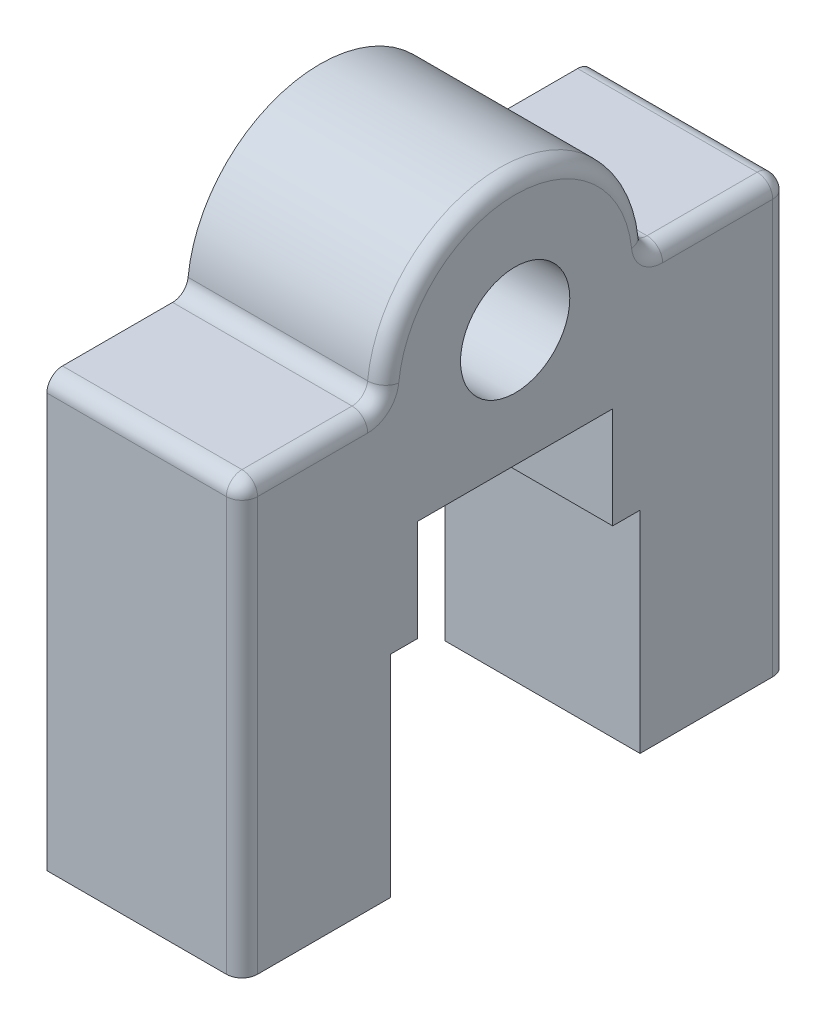
ISO-10303-21;
HEADER;
FILE_DESCRIPTION(('STEP AP214'),'2;1');
FILE_NAME('part.step','',(''),(''),'','','');
FILE_SCHEMA(('AUTOMOTIVE_DESIGN { 1 0 10303 214 1 1 1 1 }'));
ENDSEC;
DATA;
#1=APPLICATION_CONTEXT('core data for automotive mechanical design processes');
#2=APPLICATION_PROTOCOL_DEFINITION('international standard','automotive_design',2000,#1);
#3=PRODUCT_CONTEXT('',#1,'mechanical');
#4=PRODUCT('Part','Part','',(#3));
#5=PRODUCT_RELATED_PRODUCT_CATEGORY('part','',(#4));
#6=PRODUCT_DEFINITION_FORMATION('','',#4);
#7=PRODUCT_DEFINITION_CONTEXT('part definition',#1,'design');
#8=PRODUCT_DEFINITION('design','',#6,#7);
#9=PRODUCT_DEFINITION_SHAPE('','',#8);
#10=(LENGTH_UNIT() NAMED_UNIT(*) SI_UNIT(.MILLI.,.METRE.));
#11=(NAMED_UNIT(*) PLANE_ANGLE_UNIT() SI_UNIT($,.RADIAN.));
#12=(NAMED_UNIT(*) SI_UNIT($,.STERADIAN.) SOLID_ANGLE_UNIT());
#13=UNCERTAINTY_MEASURE_WITH_UNIT(LENGTH_MEASURE(1.E-05),#10,'distance_accuracy_value','');
#14=(GEOMETRIC_REPRESENTATION_CONTEXT(3) GLOBAL_UNCERTAINTY_ASSIGNED_CONTEXT((#13)) GLOBAL_UNIT_ASSIGNED_CONTEXT((#10,
#11,#12)) REPRESENTATION_CONTEXT('',''));
#15=CARTESIAN_POINT('',(0.,0.,0.));
#16=DIRECTION('',(0.,0.,1.));
#17=DIRECTION('',(1.,0.,0.));
#18=AXIS2_PLACEMENT_3D('',#15,#16,#17);
#19=CARTESIAN_POINT('',(25.,0.,35.));
#20=DIRECTION('',(0.,1.,0.));
#21=DIRECTION('',(0.,0.,1.));
#22=AXIS2_PLACEMENT_3D('',#19,#20,#21);
#23=PLANE('',#22);
#24=DIRECTION('',(0.,0.,-1.));
#25=VECTOR('',#24,1.);
#26=CARTESIAN_POINT('',(25.,0.,35.));
#27=LINE('',#26,#25);
#28=CARTESIAN_POINT('',(25.,0.,33.));
#29=VERTEX_POINT('',#28);
#30=CARTESIAN_POINT('',(25.,0.,16.));
#31=VERTEX_POINT('',#30);
#32=EDGE_CURVE('E236',#29,#31,#27,.T.);
#33=ORIENTED_EDGE('',*,*,#32,.F.);
#34=CARTESIAN_POINT('',(23.,0.,33.));
#35=DIRECTION('',(0.,1.,0.));
#36=DIRECTION('',(0.,0.,1.));
#37=AXIS2_PLACEMENT_3D('',#34,#35,#36);
#38=CIRCLE('',#37,2.);
#39=CARTESIAN_POINT('',(23.,0.,35.));
#40=VERTEX_POINT('',#39);
#41=EDGE_CURVE('E280',#29,#40,#38,.F.);
#42=ORIENTED_EDGE('',*,*,#41,.T.);
#43=DIRECTION('',(-1.,0.,0.));
#44=VECTOR('',#43,1.);
#45=CARTESIAN_POINT('',(25.,0.,35.));
#46=LINE('',#45,#44);
#47=CARTESIAN_POINT('',(0.,0.,35.));
#48=VERTEX_POINT('',#47);
#49=EDGE_CURVE('E212',#40,#48,#46,.T.);
#50=ORIENTED_EDGE('',*,*,#49,.T.);
#51=DIRECTION('',(0.,0.,-1.));
#52=VECTOR('',#51,1.);
#53=CARTESIAN_POINT('',(0.,0.,35.));
#54=LINE('',#53,#52);
#55=CARTESIAN_POINT('',(0.,0.,16.));
#56=VERTEX_POINT('',#55);
#57=EDGE_CURVE('E205',#48,#56,#54,.T.);
#58=ORIENTED_EDGE('',*,*,#57,.T.);
#59=DIRECTION('',(1.,0.,0.));
#60=VECTOR('',#59,1.);
#61=CARTESIAN_POINT('',(0.,0.,16.));
#62=LINE('',#61,#60);
#63=EDGE_CURVE('E186',#56,#31,#62,.T.);
#64=ORIENTED_EDGE('',*,*,#63,.T.);
#65=EDGE_LOOP('',(#33,#42,#50,#58,#64));
#66=FACE_BOUND('',#65,.T.);
#67=ADVANCED_FACE('F34',(#66),#23,.F.);
#68=CARTESIAN_POINT('',(25.,55.,0.));
#69=DIRECTION('',(1.,0.,0.));
#70=DIRECTION('',(0.,0.,-1.));
#71=AXIS2_PLACEMENT_3D('',#68,#69,#70);
#72=PLANE('',#71);
#73=DIRECTION('',(0.,0.,1.));
#74=VECTOR('',#73,1.);
#75=CARTESIAN_POINT('',(25.,53.,33.));
#76=LINE('',#75,#74);
#77=CARTESIAN_POINT('',(25.,53.,18.8944436276912));
#78=VERTEX_POINT('',#77);
#79=CARTESIAN_POINT('',(25.,53.,33.));
#80=VERTEX_POINT('',#79);
#81=EDGE_CURVE('E275',#78,#80,#76,.T.);
#82=ORIENTED_EDGE('',*,*,#81,.T.);
#83=DIRECTION('',(0.,-1.,0.));
#84=VECTOR('',#83,1.);
#85=CARTESIAN_POINT('',(25.,0.,33.));
#86=LINE('',#85,#84);
#87=EDGE_CURVE('E277',#80,#29,#86,.T.);
#88=ORIENTED_EDGE('',*,*,#87,.T.);
#89=ORIENTED_EDGE('',*,*,#32,.T.);
#90=DIRECTION('',(0.,-1.,0.));
#91=VECTOR('',#90,1.);
#92=CARTESIAN_POINT('',(25.,27.,16.));
#93=LINE('',#92,#91);
#94=CARTESIAN_POINT('',(25.,27.,16.));
#95=VERTEX_POINT('',#94);
#96=EDGE_CURVE('E192',#95,#31,#93,.T.);
#97=ORIENTED_EDGE('',*,*,#96,.F.);
#98=DIRECTION('',(0.,0.,1.));
#99=VECTOR('',#98,1.);
#100=CARTESIAN_POINT('',(25.,27.,16.));
#101=LINE('',#100,#99);
#102=CARTESIAN_POINT('',(25.,27.,12.5));
#103=VERTEX_POINT('',#102);
#104=EDGE_CURVE('E209',#103,#95,#101,.T.);
#105=ORIENTED_EDGE('',*,*,#104,.F.);
#106=DIRECTION('',(0.,-1.,0.));
#107=VECTOR('',#106,1.);
#108=CARTESIAN_POINT('',(25.,27.,12.5));
#109=LINE('',#108,#107);
#110=CARTESIAN_POINT('',(25.,40.,12.5));
#111=VERTEX_POINT('',#110);
#112=EDGE_CURVE('E340',#111,#103,#109,.T.);
#113=ORIENTED_EDGE('',*,*,#112,.F.);
#114=DIRECTION('',(0.,0.,1.));
#115=VECTOR('',#114,1.);
#116=CARTESIAN_POINT('',(25.,40.,12.5));
#117=LINE('',#116,#115);
#118=CARTESIAN_POINT('',(25.,40.,-12.5));
#119=VERTEX_POINT('',#118);
#120=EDGE_CURVE('E337',#119,#111,#117,.T.);
#121=ORIENTED_EDGE('',*,*,#120,.F.);
#122=DIRECTION('',(0.,1.,0.));
#123=VECTOR('',#122,1.);
#124=CARTESIAN_POINT('',(25.,27.,-12.5));
#125=LINE('',#124,#123);
#126=CARTESIAN_POINT('',(25.,27.,-12.5));
#127=VERTEX_POINT('',#126);
#128=EDGE_CURVE('E334',#127,#119,#125,.T.);
#129=ORIENTED_EDGE('',*,*,#128,.F.);
#130=DIRECTION('',(0.,0.,1.));
#131=VECTOR('',#130,1.);
#132=CARTESIAN_POINT('',(25.,27.,-12.5));
#133=LINE('',#132,#131);
#134=CARTESIAN_POINT('',(25.,27.,-16.));
#135=VERTEX_POINT('',#134);
#136=EDGE_CURVE('E327',#135,#127,#133,.T.);
#137=ORIENTED_EDGE('',*,*,#136,.F.);
#138=DIRECTION('',(0.,1.,0.));
#139=VECTOR('',#138,1.);
#140=CARTESIAN_POINT('',(25.,27.,-16.));
#141=LINE('',#140,#139);
#142=CARTESIAN_POINT('',(25.,0.,-16.));
#143=VERTEX_POINT('',#142);
#144=EDGE_CURVE('E324',#143,#135,#141,.T.);
#145=ORIENTED_EDGE('',*,*,#144,.F.);
#146=CARTESIAN_POINT('',(25.,0.,-33.));
#147=VERTEX_POINT('',#146);
#148=EDGE_CURVE('E233',#143,#147,#27,.T.);
#149=ORIENTED_EDGE('',*,*,#148,.T.);
#150=DIRECTION('',(0.,1.,0.));
#151=VECTOR('',#150,1.);
#152=CARTESIAN_POINT('',(25.,53.,-33.));
#153=LINE('',#152,#151);
#154=CARTESIAN_POINT('',(25.,53.,-33.));
#155=VERTEX_POINT('',#154);
#156=EDGE_CURVE('E265',#147,#155,#153,.T.);
#157=ORIENTED_EDGE('',*,*,#156,.T.);
#158=DIRECTION('',(0.,0.,1.));
#159=VECTOR('',#158,1.);
#160=CARTESIAN_POINT('',(25.,53.,-18.8944436276912));
#161=LINE('',#160,#159);
#162=CARTESIAN_POINT('',(25.,53.,-18.8944436276912));
#163=VERTEX_POINT('',#162);
#164=EDGE_CURVE('E267',#155,#163,#161,.T.);
#165=ORIENTED_EDGE('',*,*,#164,.T.);
#166=CARTESIAN_POINT('',(25.,57.,-18.8944436276912));
#167=DIRECTION('',(1.,0.,0.));
#168=DIRECTION('',(0.,0.,-1.));
#169=AXIS2_PLACEMENT_3D('',#166,#167,#168);
#170=CIRCLE('',#169,4.);
#171=CARTESIAN_POINT('',(25.,56.578947368421,-14.9166660218615));
#172=VERTEX_POINT('',#171);
#173=EDGE_CURVE('E269',#163,#172,#170,.F.);
#174=ORIENTED_EDGE('',*,*,#173,.T.);
#175=CARTESIAN_POINT('',(25.,55.,0.));
#176=DIRECTION('',(1.,0.,0.));
#177=DIRECTION('',(0.,0.,-1.));
#178=AXIS2_PLACEMENT_3D('',#175,#176,#177);
#179=CIRCLE('',#178,15.);
#180=CARTESIAN_POINT('',(25.,56.578947368421,14.9166660218615));
#181=VERTEX_POINT('',#180);
#182=EDGE_CURVE('E271',#172,#181,#179,.T.);
#183=ORIENTED_EDGE('',*,*,#182,.T.);
#184=CARTESIAN_POINT('',(25.,57.,18.8944436276912));
#185=DIRECTION('',(1.,0.,0.));
#186=DIRECTION('',(0.,0.,-1.));
#187=AXIS2_PLACEMENT_3D('',#184,#185,#186);
#188=CIRCLE('',#187,4.);
#189=EDGE_CURVE('E273',#181,#78,#188,.F.);
#190=ORIENTED_EDGE('',*,*,#189,.T.);
#191=EDGE_LOOP('',(#82,#88,#89,#97,#105,#113,#121,#129,#137,#145,#149,#157,#165,#174,#183,#190));
#192=FACE_BOUND('',#191,.T.);
#193=CARTESIAN_POINT('',(25.,55.,0.));
#194=DIRECTION('',(1.,0.,0.));
#195=DIRECTION('',(0.,0.,-1.));
#196=AXIS2_PLACEMENT_3D('',#193,#194,#195);
#197=CIRCLE('',#196,7.);
#198=CARTESIAN_POINT('',(25.,55.,-7.));
#199=VERTEX_POINT('',#198);
#200=EDGE_CURVE('E359',#199,#199,#197,.T.);
#201=ORIENTED_EDGE('',*,*,#200,.F.);
#202=EDGE_LOOP('',(#201));
#203=FACE_BOUND('',#202,.T.);
#204=ADVANCED_FACE('F368',(#192,#203),#72,.T.);
#205=CARTESIAN_POINT('',(0.,55.,0.));
#206=DIRECTION('',(1.,0.,0.));
#207=DIRECTION('',(0.,0.,-1.));
#208=AXIS2_PLACEMENT_3D('',#205,#206,#207);
#209=PLANE('',#208);
#210=DIRECTION('',(0.,0.,1.));
#211=VECTOR('',#210,1.);
#212=CARTESIAN_POINT('',(0.,55.,-17.));
#213=LINE('',#212,#211);
#214=CARTESIAN_POINT('',(0.,55.,-33.));
#215=VERTEX_POINT('',#214);
#216=CARTESIAN_POINT('',(0.,55.,-18.8944436276912));
#217=VERTEX_POINT('',#216);
#218=EDGE_CURVE('E218',#215,#217,#213,.T.);
#219=ORIENTED_EDGE('',*,*,#218,.F.);
#220=CARTESIAN_POINT('',(0.,53.,-33.));
#221=DIRECTION('',(1.,0.,0.));
#222=DIRECTION('',(0.,0.,-1.));
#223=AXIS2_PLACEMENT_3D('',#220,#221,#222);
#224=CIRCLE('',#223,2.);
#225=CARTESIAN_POINT('',(0.,53.,-35.));
#226=VERTEX_POINT('',#225);
#227=EDGE_CURVE('E245',#215,#226,#224,.F.);
#228=ORIENTED_EDGE('',*,*,#227,.T.);
#229=DIRECTION('',(0.,1.,0.));
#230=VECTOR('',#229,1.);
#231=CARTESIAN_POINT('',(0.,0.,-35.));
#232=LINE('',#231,#230);
#233=CARTESIAN_POINT('',(0.,0.,-35.));
#234=VERTEX_POINT('',#233);
#235=EDGE_CURVE('E214',#234,#226,#232,.T.);
#236=ORIENTED_EDGE('',*,*,#235,.F.);
#237=CARTESIAN_POINT('',(0.,0.,-16.));
#238=VERTEX_POINT('',#237);
#239=EDGE_CURVE('E215',#238,#234,#54,.T.);
#240=ORIENTED_EDGE('',*,*,#239,.F.);
#241=DIRECTION('',(0.,1.,0.));
#242=VECTOR('',#241,1.);
#243=CARTESIAN_POINT('',(0.,27.,-16.));
#244=LINE('',#243,#242);
#245=CARTESIAN_POINT('',(0.,27.,-16.));
#246=VERTEX_POINT('',#245);
#247=EDGE_CURVE('E208',#238,#246,#244,.T.);
#248=ORIENTED_EDGE('',*,*,#247,.T.);
#249=DIRECTION('',(0.,0.,1.));
#250=VECTOR('',#249,1.);
#251=CARTESIAN_POINT('',(0.,27.,-12.5));
#252=LINE('',#251,#250);
#253=CARTESIAN_POINT('',(0.,27.,-12.5));
#254=VERTEX_POINT('',#253);
#255=EDGE_CURVE('E513',#246,#254,#252,.T.);
#256=ORIENTED_EDGE('',*,*,#255,.T.);
#257=DIRECTION('',(0.,1.,0.));
#258=VECTOR('',#257,1.);
#259=CARTESIAN_POINT('',(0.,27.,-12.5));
#260=LINE('',#259,#258);
#261=CARTESIAN_POINT('',(0.,40.,-12.5));
#262=VERTEX_POINT('',#261);
#263=EDGE_CURVE('E516',#254,#262,#260,.T.);
#264=ORIENTED_EDGE('',*,*,#263,.T.);
#265=DIRECTION('',(0.,0.,1.));
#266=VECTOR('',#265,1.);
#267=CARTESIAN_POINT('',(0.,40.,12.5));
#268=LINE('',#267,#266);
#269=CARTESIAN_POINT('',(0.,40.,12.5));
#270=VERTEX_POINT('',#269);
#271=EDGE_CURVE('E508',#262,#270,#268,.T.);
#272=ORIENTED_EDGE('',*,*,#271,.T.);
#273=DIRECTION('',(0.,-1.,0.));
#274=VECTOR('',#273,1.);
#275=CARTESIAN_POINT('',(0.,27.,12.5));
#276=LINE('',#275,#274);
#277=CARTESIAN_POINT('',(0.,27.,12.5));
#278=VERTEX_POINT('',#277);
#279=EDGE_CURVE('E505',#270,#278,#276,.T.);
#280=ORIENTED_EDGE('',*,*,#279,.T.);
#281=DIRECTION('',(0.,0.,1.));
#282=VECTOR('',#281,1.);
#283=CARTESIAN_POINT('',(0.,27.,16.));
#284=LINE('',#283,#282);
#285=CARTESIAN_POINT('',(0.,27.,16.));
#286=VERTEX_POINT('',#285);
#287=EDGE_CURVE('E197',#278,#286,#284,.T.);
#288=ORIENTED_EDGE('',*,*,#287,.T.);
#289=DIRECTION('',(0.,-1.,0.));
#290=VECTOR('',#289,1.);
#291=CARTESIAN_POINT('',(0.,27.,16.));
#292=LINE('',#291,#290);
#293=EDGE_CURVE('E189',#286,#56,#292,.T.);
#294=ORIENTED_EDGE('',*,*,#293,.T.);
#295=ORIENTED_EDGE('',*,*,#57,.F.);
#296=DIRECTION('',(0.,-1.,0.));
#297=VECTOR('',#296,1.);
#298=CARTESIAN_POINT('',(0.,0.,35.));
#299=LINE('',#298,#297);
#300=CARTESIAN_POINT('',(0.,53.,35.));
#301=VERTEX_POINT('',#300);
#302=EDGE_CURVE('E221',#301,#48,#299,.T.);
#303=ORIENTED_EDGE('',*,*,#302,.F.);
#304=CARTESIAN_POINT('',(0.,53.,33.));
#305=DIRECTION('',(1.,0.,0.));
#306=DIRECTION('',(0.,0.,-1.));
#307=AXIS2_PLACEMENT_3D('',#304,#305,#306);
#308=CIRCLE('',#307,2.);
#309=CARTESIAN_POINT('',(0.,55.,33.));
#310=VERTEX_POINT('',#309);
#311=EDGE_CURVE('E243',#301,#310,#308,.F.);
#312=ORIENTED_EDGE('',*,*,#311,.T.);
#313=DIRECTION('',(0.,0.,1.));
#314=VECTOR('',#313,1.);
#315=CARTESIAN_POINT('',(0.,55.,35.));
#316=LINE('',#315,#314);
#317=CARTESIAN_POINT('',(0.,55.,18.8944436276912));
#318=VERTEX_POINT('',#317);
#319=EDGE_CURVE('E230',#318,#310,#316,.T.);
#320=ORIENTED_EDGE('',*,*,#319,.F.);
#321=CARTESIAN_POINT('',(0.,57.,18.8944436276912));
#322=DIRECTION('',(1.,0.,0.));
#323=DIRECTION('',(0.,0.,-1.));
#324=AXIS2_PLACEMENT_3D('',#321,#322,#323);
#325=CIRCLE('',#324,2.);
#326=CARTESIAN_POINT('',(0.,56.7894736842105,16.9055548247763));
#327=VERTEX_POINT('',#326);
#328=EDGE_CURVE('E263',#318,#327,#325,.T.);
#329=ORIENTED_EDGE('',*,*,#328,.T.);
#330=CARTESIAN_POINT('',(0.,55.,0.));
#331=DIRECTION('',(1.,0.,0.));
#332=DIRECTION('',(0.,0.,-1.));
#333=AXIS2_PLACEMENT_3D('',#330,#331,#332);
#334=CIRCLE('',#333,17.);
#335=CARTESIAN_POINT('',(0.,56.7894736842105,-16.9055548247763));
#336=VERTEX_POINT('',#335);
#337=EDGE_CURVE('E227',#336,#327,#334,.T.);
#338=ORIENTED_EDGE('',*,*,#337,.F.);
#339=CARTESIAN_POINT('',(0.,57.,-18.8944436276912));
#340=DIRECTION('',(1.,0.,0.));
#341=DIRECTION('',(0.,0.,-1.));
#342=AXIS2_PLACEMENT_3D('',#339,#340,#341);
#343=CIRCLE('',#342,2.);
#344=EDGE_CURVE('E261',#336,#217,#343,.T.);
#345=ORIENTED_EDGE('',*,*,#344,.T.);
#346=EDGE_LOOP('',(#219,#228,#236,#240,#248,#256,#264,#272,#280,#288,#294,#295,#303,#312,#320,
#329,#338,#345));
#347=FACE_BOUND('',#346,.T.);
#348=CARTESIAN_POINT('',(0.,55.,0.));
#349=DIRECTION('',(1.,0.,0.));
#350=DIRECTION('',(0.,0.,-1.));
#351=AXIS2_PLACEMENT_3D('',#348,#349,#350);
#352=CIRCLE('',#351,7.);
#353=CARTESIAN_POINT('',(0.,55.,-7.));
#354=VERTEX_POINT('',#353);
#355=EDGE_CURVE('E347',#354,#354,#352,.T.);
#356=ORIENTED_EDGE('',*,*,#355,.T.);
#357=EDGE_LOOP('',(#356));
#358=FACE_BOUND('',#357,.T.);
#359=ADVANCED_FACE('F202',(#347,#358),#209,.F.);
#360=CARTESIAN_POINT('',(25.,0.,35.));
#361=DIRECTION('',(0.,0.,-1.));
#362=DIRECTION('',(-1.,0.,0.));
#363=AXIS2_PLACEMENT_3D('',#360,#361,#362);
#364=PLANE('',#363);
#365=ORIENTED_EDGE('',*,*,#49,.F.);
#366=DIRECTION('',(0.,-1.,0.));
#367=VECTOR('',#366,1.);
#368=CARTESIAN_POINT('',(23.,53.,35.));
#369=LINE('',#368,#367);
#370=CARTESIAN_POINT('',(23.,53.,35.));
#371=VERTEX_POINT('',#370);
#372=EDGE_CURVE('E282',#40,#371,#369,.F.);
#373=ORIENTED_EDGE('',*,*,#372,.T.);
#374=DIRECTION('',(-1.,0.,0.));
#375=VECTOR('',#374,1.);
#376=CARTESIAN_POINT('',(25.,53.,35.));
#377=LINE('',#376,#375);
#378=EDGE_CURVE('E259',#371,#301,#377,.T.);
#379=ORIENTED_EDGE('',*,*,#378,.T.);
#380=ORIENTED_EDGE('',*,*,#302,.T.);
#381=EDGE_LOOP('',(#365,#373,#379,#380));
#382=FACE_BOUND('',#381,.T.);
#383=ADVANCED_FACE('F407',(#382),#364,.F.);
#384=DIRECTION('',(-1.,0.,0.));
#385=VECTOR('',#384,1.);
#386=CARTESIAN_POINT('',(25.,0.,-35.));
#387=LINE('',#386,#385);
#388=CARTESIAN_POINT('',(23.,0.,-35.));
#389=VERTEX_POINT('',#388);
#390=EDGE_CURVE('E234',#389,#234,#387,.T.);
#391=ORIENTED_EDGE('',*,*,#390,.F.);
#392=CARTESIAN_POINT('',(23.,0.,-33.));
#393=DIRECTION('',(0.,1.,0.));
#394=DIRECTION('',(0.,0.,1.));
#395=AXIS2_PLACEMENT_3D('',#392,#393,#394);
#396=CIRCLE('',#395,2.);
#397=EDGE_CURVE('E11',#389,#147,#396,.F.);
#398=ORIENTED_EDGE('',*,*,#397,.T.);
#399=ORIENTED_EDGE('',*,*,#148,.F.);
#400=DIRECTION('',(1.,0.,0.));
#401=VECTOR('',#400,1.);
#402=CARTESIAN_POINT('',(0.,0.,-16.));
#403=LINE('',#402,#401);
#404=EDGE_CURVE('E196',#238,#143,#403,.T.);
#405=ORIENTED_EDGE('',*,*,#404,.F.);
#406=ORIENTED_EDGE('',*,*,#239,.T.);
#407=EDGE_LOOP('',(#391,#398,#399,#405,#406));
#408=FACE_BOUND('',#407,.T.);
#409=ADVANCED_FACE('F431',(#408),#23,.F.);
#410=CARTESIAN_POINT('',(25.,0.,-35.));
#411=DIRECTION('',(0.,0.,1.));
#412=DIRECTION('',(1.,0.,0.));
#413=AXIS2_PLACEMENT_3D('',#410,#411,#412);
#414=PLANE('',#413);
#415=DIRECTION('',(-1.,0.,0.));
#416=VECTOR('',#415,1.);
#417=CARTESIAN_POINT('',(25.,53.,-35.));
#418=LINE('',#417,#416);
#419=CARTESIAN_POINT('',(23.,53.,-35.));
#420=VERTEX_POINT('',#419);
#421=EDGE_CURVE('E247',#226,#420,#418,.F.);
#422=ORIENTED_EDGE('',*,*,#421,.T.);
#423=DIRECTION('',(0.,1.,0.));
#424=VECTOR('',#423,1.);
#425=CARTESIAN_POINT('',(23.,0.,-35.));
#426=LINE('',#425,#424);
#427=EDGE_CURVE('E43',#420,#389,#426,.F.);
#428=ORIENTED_EDGE('',*,*,#427,.T.);
#429=ORIENTED_EDGE('',*,*,#390,.T.);
#430=ORIENTED_EDGE('',*,*,#235,.T.);
#431=EDGE_LOOP('',(#422,#428,#429,#430));
#432=FACE_BOUND('',#431,.T.);
#433=ADVANCED_FACE('F439',(#432),#414,.F.);
#434=CARTESIAN_POINT('',(25.,55.,-17.));
#435=DIRECTION('',(0.,-1.,0.));
#436=DIRECTION('',(0.,0.,-1.));
#437=AXIS2_PLACEMENT_3D('',#434,#435,#436);
#438=PLANE('',#437);
#439=DIRECTION('',(1.,0.,0.));
#440=VECTOR('',#439,1.);
#441=CARTESIAN_POINT('',(25.,55.,-18.8944436276912));
#442=LINE('',#441,#440);
#443=CARTESIAN_POINT('',(23.,55.,-18.8944436276912));
#444=VERTEX_POINT('',#443);
#445=EDGE_CURVE('E238',#217,#444,#442,.T.);
#446=ORIENTED_EDGE('',*,*,#445,.T.);
#447=DIRECTION('',(0.,0.,1.));
#448=VECTOR('',#447,1.);
#449=CARTESIAN_POINT('',(23.,55.,-33.));
#450=LINE('',#449,#448);
#451=CARTESIAN_POINT('',(23.,55.,-33.));
#452=VERTEX_POINT('',#451);
#453=EDGE_CURVE('E294',#444,#452,#450,.F.);
#454=ORIENTED_EDGE('',*,*,#453,.T.);
#455=DIRECTION('',(-1.,0.,0.));
#456=VECTOR('',#455,1.);
#457=CARTESIAN_POINT('',(25.,55.,-33.));
#458=LINE('',#457,#456);
#459=EDGE_CURVE('E241',#452,#215,#458,.T.);
#460=ORIENTED_EDGE('',*,*,#459,.T.);
#461=ORIENTED_EDGE('',*,*,#218,.T.);
#462=EDGE_LOOP('',(#446,#454,#460,#461));
#463=FACE_BOUND('',#462,.T.);
#464=ADVANCED_FACE('F444',(#463),#438,.F.);
#465=CARTESIAN_POINT('',(25.,55.,0.));
#466=DIRECTION('',(-1.,0.,0.));
#467=DIRECTION('',(0.,0.,1.));
#468=AXIS2_PLACEMENT_3D('',#465,#466,#467);
#469=CYLINDRICAL_SURFACE('',#468,17.);
#470=DIRECTION('',(-1.,0.,0.));
#471=VECTOR('',#470,1.);
#472=CARTESIAN_POINT('',(25.,56.7894736842105,16.9055548247763));
#473=LINE('',#472,#471);
#474=CARTESIAN_POINT('',(23.,56.7894736842105,16.9055548247763));
#475=VERTEX_POINT('',#474);
#476=EDGE_CURVE('E249',#327,#475,#473,.F.);
#477=ORIENTED_EDGE('',*,*,#476,.T.);
#478=CARTESIAN_POINT('',(23.,55.,0.));
#479=DIRECTION('',(1.,0.,0.));
#480=DIRECTION('',(0.,0.,-1.));
#481=AXIS2_PLACEMENT_3D('',#478,#479,#480);
#482=CIRCLE('',#481,17.);
#483=CARTESIAN_POINT('',(23.,56.7894736842105,-16.9055548247763));
#484=VERTEX_POINT('',#483);
#485=EDGE_CURVE('E290',#475,#484,#482,.F.);
#486=ORIENTED_EDGE('',*,*,#485,.T.);
#487=DIRECTION('',(-1.,0.,0.));
#488=VECTOR('',#487,1.);
#489=CARTESIAN_POINT('',(25.,56.7894736842105,-16.9055548247763));
#490=LINE('',#489,#488);
#491=EDGE_CURVE('E252',#484,#336,#490,.T.);
#492=ORIENTED_EDGE('',*,*,#491,.T.);
#493=ORIENTED_EDGE('',*,*,#337,.T.);
#494=EDGE_LOOP('',(#477,#486,#492,#493));
#495=FACE_BOUND('',#494,.T.);
#496=ADVANCED_FACE('F456',(#495),#469,.T.);
#497=CARTESIAN_POINT('',(25.,55.,35.));
#498=DIRECTION('',(0.,-1.,0.));
#499=DIRECTION('',(0.,0.,-1.));
#500=AXIS2_PLACEMENT_3D('',#497,#498,#499);
#501=PLANE('',#500);
#502=DIRECTION('',(-1.,0.,0.));
#503=VECTOR('',#502,1.);
#504=CARTESIAN_POINT('',(25.,55.,33.));
#505=LINE('',#504,#503);
#506=CARTESIAN_POINT('',(23.,55.,33.));
#507=VERTEX_POINT('',#506);
#508=EDGE_CURVE('E254',#310,#507,#505,.F.);
#509=ORIENTED_EDGE('',*,*,#508,.T.);
#510=DIRECTION('',(0.,0.,1.));
#511=VECTOR('',#510,1.);
#512=CARTESIAN_POINT('',(23.,55.,18.8944436276912));
#513=LINE('',#512,#511);
#514=CARTESIAN_POINT('',(23.,55.,18.8944436276912));
#515=VERTEX_POINT('',#514);
#516=EDGE_CURVE('E286',#507,#515,#513,.F.);
#517=ORIENTED_EDGE('',*,*,#516,.T.);
#518=DIRECTION('',(1.,0.,0.));
#519=VECTOR('',#518,1.);
#520=CARTESIAN_POINT('',(0.,55.,18.8944436276912));
#521=LINE('',#520,#519);
#522=EDGE_CURVE('E257',#515,#318,#521,.F.);
#523=ORIENTED_EDGE('',*,*,#522,.T.);
#524=ORIENTED_EDGE('',*,*,#319,.T.);
#525=EDGE_LOOP('',(#509,#517,#523,#524));
#526=FACE_BOUND('',#525,.T.);
#527=ADVANCED_FACE('F414',(#526),#501,.F.);
#528=CARTESIAN_POINT('',(25.,55.,0.));
#529=DIRECTION('',(-1.,0.,0.));
#530=DIRECTION('',(0.,0.,1.));
#531=AXIS2_PLACEMENT_3D('',#528,#529,#530);
#532=CYLINDRICAL_SURFACE('',#531,7.);
#533=ORIENTED_EDGE('',*,*,#200,.T.);
#534=EDGE_LOOP('',(#533));
#535=FACE_BOUND('',#534,.T.);
#536=ORIENTED_EDGE('',*,*,#355,.F.);
#537=EDGE_LOOP('',(#536));
#538=FACE_BOUND('',#537,.T.);
#539=ADVANCED_FACE('F464',(#535,#538),#532,.F.);
#540=CARTESIAN_POINT('',(0.,27.,16.));
#541=DIRECTION('',(0.,0.,1.));
#542=DIRECTION('',(1.,0.,0.));
#543=AXIS2_PLACEMENT_3D('',#540,#541,#542);
#544=PLANE('',#543);
#545=ORIENTED_EDGE('',*,*,#96,.T.);
#546=ORIENTED_EDGE('',*,*,#63,.F.);
#547=ORIENTED_EDGE('',*,*,#293,.F.);
#548=DIRECTION('',(1.,0.,0.));
#549=VECTOR('',#548,1.);
#550=CARTESIAN_POINT('',(0.,27.,16.));
#551=LINE('',#550,#549);
#552=EDGE_CURVE('E345',#286,#95,#551,.T.);
#553=ORIENTED_EDGE('',*,*,#552,.T.);
#554=EDGE_LOOP('',(#545,#546,#547,#553));
#555=FACE_BOUND('',#554,.T.);
#556=ADVANCED_FACE('F188',(#555),#544,.F.);
#557=CARTESIAN_POINT('',(0.,27.,16.));
#558=DIRECTION('',(0.,1.,0.));
#559=DIRECTION('',(0.,0.,1.));
#560=AXIS2_PLACEMENT_3D('',#557,#558,#559);
#561=PLANE('',#560);
#562=ORIENTED_EDGE('',*,*,#104,.T.);
#563=ORIENTED_EDGE('',*,*,#552,.F.);
#564=ORIENTED_EDGE('',*,*,#287,.F.);
#565=DIRECTION('',(1.,0.,0.));
#566=VECTOR('',#565,1.);
#567=CARTESIAN_POINT('',(0.,27.,12.5));
#568=LINE('',#567,#566);
#569=EDGE_CURVE('E348',#278,#103,#568,.T.);
#570=ORIENTED_EDGE('',*,*,#569,.T.);
#571=EDGE_LOOP('',(#562,#563,#564,#570));
#572=FACE_BOUND('',#571,.T.);
#573=ADVANCED_FACE('F475',(#572),#561,.F.);
#574=CARTESIAN_POINT('',(0.,27.,12.5));
#575=DIRECTION('',(0.,0.,1.));
#576=DIRECTION('',(1.,0.,0.));
#577=AXIS2_PLACEMENT_3D('',#574,#575,#576);
#578=PLANE('',#577);
#579=ORIENTED_EDGE('',*,*,#112,.T.);
#580=ORIENTED_EDGE('',*,*,#569,.F.);
#581=ORIENTED_EDGE('',*,*,#279,.F.);
#582=DIRECTION('',(1.,0.,0.));
#583=VECTOR('',#582,1.);
#584=CARTESIAN_POINT('',(0.,40.,12.5));
#585=LINE('',#584,#583);
#586=EDGE_CURVE('E350',#270,#111,#585,.T.);
#587=ORIENTED_EDGE('',*,*,#586,.T.);
#588=EDGE_LOOP('',(#579,#580,#581,#587));
#589=FACE_BOUND('',#588,.T.);
#590=ADVANCED_FACE('F491',(#589),#578,.F.);
#591=CARTESIAN_POINT('',(0.,40.,12.5));
#592=DIRECTION('',(0.,1.,0.));
#593=DIRECTION('',(0.,0.,1.));
#594=AXIS2_PLACEMENT_3D('',#591,#592,#593);
#595=PLANE('',#594);
#596=ORIENTED_EDGE('',*,*,#120,.T.);
#597=ORIENTED_EDGE('',*,*,#586,.F.);
#598=ORIENTED_EDGE('',*,*,#271,.F.);
#599=DIRECTION('',(1.,0.,0.));
#600=VECTOR('',#599,1.);
#601=CARTESIAN_POINT('',(0.,40.,-12.5));
#602=LINE('',#601,#600);
#603=EDGE_CURVE('E352',#262,#119,#602,.T.);
#604=ORIENTED_EDGE('',*,*,#603,.T.);
#605=EDGE_LOOP('',(#596,#597,#598,#604));
#606=FACE_BOUND('',#605,.T.);
#607=ADVANCED_FACE('F487',(#606),#595,.F.);
#608=CARTESIAN_POINT('',(0.,27.,-12.5));
#609=DIRECTION('',(0.,0.,-1.));
#610=DIRECTION('',(-1.,0.,0.));
#611=AXIS2_PLACEMENT_3D('',#608,#609,#610);
#612=PLANE('',#611);
#613=ORIENTED_EDGE('',*,*,#128,.T.);
#614=ORIENTED_EDGE('',*,*,#603,.F.);
#615=ORIENTED_EDGE('',*,*,#263,.F.);
#616=DIRECTION('',(1.,0.,0.));
#617=VECTOR('',#616,1.);
#618=CARTESIAN_POINT('',(0.,27.,-12.5));
#619=LINE('',#618,#617);
#620=EDGE_CURVE('E354',#254,#127,#619,.T.);
#621=ORIENTED_EDGE('',*,*,#620,.T.);
#622=EDGE_LOOP('',(#613,#614,#615,#621));
#623=FACE_BOUND('',#622,.T.);
#624=ADVANCED_FACE('F483',(#623),#612,.F.);
#625=CARTESIAN_POINT('',(0.,27.,-12.5));
#626=DIRECTION('',(0.,1.,0.));
#627=DIRECTION('',(0.,0.,1.));
#628=AXIS2_PLACEMENT_3D('',#625,#626,#627);
#629=PLANE('',#628);
#630=ORIENTED_EDGE('',*,*,#136,.T.);
#631=ORIENTED_EDGE('',*,*,#620,.F.);
#632=ORIENTED_EDGE('',*,*,#255,.F.);
#633=DIRECTION('',(1.,0.,0.));
#634=VECTOR('',#633,1.);
#635=CARTESIAN_POINT('',(0.,27.,-16.));
#636=LINE('',#635,#634);
#637=EDGE_CURVE('E356',#246,#135,#636,.T.);
#638=ORIENTED_EDGE('',*,*,#637,.T.);
#639=EDGE_LOOP('',(#630,#631,#632,#638));
#640=FACE_BOUND('',#639,.T.);
#641=ADVANCED_FACE('F479',(#640),#629,.F.);
#642=CARTESIAN_POINT('',(0.,27.,-16.));
#643=DIRECTION('',(0.,0.,-1.));
#644=DIRECTION('',(0.,1.,0.));
#645=AXIS2_PLACEMENT_3D('',#642,#643,#644);
#646=PLANE('',#645);
#647=ORIENTED_EDGE('',*,*,#144,.T.);
#648=ORIENTED_EDGE('',*,*,#637,.F.);
#649=ORIENTED_EDGE('',*,*,#247,.F.);
#650=ORIENTED_EDGE('',*,*,#404,.T.);
#651=EDGE_LOOP('',(#647,#648,#649,#650));
#652=FACE_BOUND('',#651,.T.);
#653=ADVANCED_FACE('F476',(#652),#646,.F.);
#654=CARTESIAN_POINT('',(25.,53.,-33.));
#655=DIRECTION('',(-1.,0.,0.));
#656=DIRECTION('',(0.,0.,1.));
#657=AXIS2_PLACEMENT_3D('',#654,#655,#656);
#658=CYLINDRICAL_SURFACE('',#657,2.);
#659=ORIENTED_EDGE('',*,*,#459,.F.);
#660=CARTESIAN_POINT('',(23.,53.,-33.));
#661=DIRECTION('',(-1.,0.,0.));
#662=DIRECTION('',(0.,0.,1.));
#663=AXIS2_PLACEMENT_3D('',#660,#661,#662);
#664=CIRCLE('',#663,2.);
#665=EDGE_CURVE('E58',#452,#420,#664,.T.);
#666=ORIENTED_EDGE('',*,*,#665,.T.);
#667=ORIENTED_EDGE('',*,*,#421,.F.);
#668=ORIENTED_EDGE('',*,*,#227,.F.);
#669=EDGE_LOOP('',(#659,#666,#667,#668));
#670=FACE_BOUND('',#669,.T.);
#671=ADVANCED_FACE('F448',(#670),#658,.T.);
#672=CARTESIAN_POINT('',(25.,57.,-18.8944436276912));
#673=DIRECTION('',(-1.,0.,0.));
#674=DIRECTION('',(0.,0.,1.));
#675=AXIS2_PLACEMENT_3D('',#672,#673,#674);
#676=CYLINDRICAL_SURFACE('',#675,2.);
#677=ORIENTED_EDGE('',*,*,#491,.F.);
#678=CARTESIAN_POINT('',(23.,57.,-18.8944436276912));
#679=DIRECTION('',(1.,0.,0.));
#680=DIRECTION('',(0.,0.,-1.));
#681=AXIS2_PLACEMENT_3D('',#678,#679,#680);
#682=CIRCLE('',#681,2.);
#683=EDGE_CURVE('E292',#484,#444,#682,.T.);
#684=ORIENTED_EDGE('',*,*,#683,.T.);
#685=ORIENTED_EDGE('',*,*,#445,.F.);
#686=ORIENTED_EDGE('',*,*,#344,.F.);
#687=EDGE_LOOP('',(#677,#684,#685,#686));
#688=FACE_BOUND('',#687,.T.);
#689=ADVANCED_FACE('F425',(#688),#676,.F.);
#690=CARTESIAN_POINT('',(25.,57.,18.8944436276912));
#691=DIRECTION('',(-1.,0.,0.));
#692=DIRECTION('',(0.,0.,1.));
#693=AXIS2_PLACEMENT_3D('',#690,#691,#692);
#694=CYLINDRICAL_SURFACE('',#693,2.);
#695=ORIENTED_EDGE('',*,*,#522,.F.);
#696=CARTESIAN_POINT('',(23.,57.,18.8944436276912));
#697=DIRECTION('',(1.,0.,0.));
#698=DIRECTION('',(0.,0.,-1.));
#699=AXIS2_PLACEMENT_3D('',#696,#697,#698);
#700=CIRCLE('',#699,2.);
#701=EDGE_CURVE('E288',#515,#475,#700,.T.);
#702=ORIENTED_EDGE('',*,*,#701,.T.);
#703=ORIENTED_EDGE('',*,*,#476,.F.);
#704=ORIENTED_EDGE('',*,*,#328,.F.);
#705=EDGE_LOOP('',(#695,#702,#703,#704));
#706=FACE_BOUND('',#705,.T.);
#707=ADVANCED_FACE('F419',(#706),#694,.F.);
#708=CARTESIAN_POINT('',(25.,53.,33.));
#709=DIRECTION('',(-1.,0.,0.));
#710=DIRECTION('',(0.,0.,1.));
#711=AXIS2_PLACEMENT_3D('',#708,#709,#710);
#712=CYLINDRICAL_SURFACE('',#711,2.);
#713=ORIENTED_EDGE('',*,*,#378,.F.);
#714=CARTESIAN_POINT('',(23.,53.,33.));
#715=DIRECTION('',(-1.,0.,0.));
#716=DIRECTION('',(0.,0.,1.));
#717=AXIS2_PLACEMENT_3D('',#714,#715,#716);
#718=CIRCLE('',#717,2.);
#719=EDGE_CURVE('E284',#371,#507,#718,.T.);
#720=ORIENTED_EDGE('',*,*,#719,.T.);
#721=ORIENTED_EDGE('',*,*,#508,.F.);
#722=ORIENTED_EDGE('',*,*,#311,.F.);
#723=EDGE_LOOP('',(#713,#720,#721,#722));
#724=FACE_BOUND('',#723,.T.);
#725=ADVANCED_FACE('F417',(#724),#712,.T.);
#726=CARTESIAN_POINT('',(23.,55.,-33.));
#727=DIRECTION('',(0.,-1.,0.));
#728=DIRECTION('',(0.,0.,-1.));
#729=AXIS2_PLACEMENT_3D('',#726,#727,#728);
#730=CYLINDRICAL_SURFACE('',#729,2.);
#731=ORIENTED_EDGE('',*,*,#397,.F.);
#732=ORIENTED_EDGE('',*,*,#427,.F.);
#733=CARTESIAN_POINT('',(23.,53.,-33.));
#734=DIRECTION('',(0.,1.,0.));
#735=DIRECTION('',(0.,0.,1.));
#736=AXIS2_PLACEMENT_3D('',#733,#734,#735);
#737=CIRCLE('',#736,2.);
#738=EDGE_CURVE('E38',#155,#420,#737,.T.);
#739=ORIENTED_EDGE('',*,*,#738,.F.);
#740=ORIENTED_EDGE('',*,*,#156,.F.);
#741=EDGE_LOOP('',(#731,#732,#739,#740));
#742=FACE_BOUND('',#741,.T.);
#743=ADVANCED_FACE('F36',(#742),#730,.T.);
#744=CARTESIAN_POINT('',(23.,53.,-33.));
#745=DIRECTION('',(0.,0.,1.));
#746=DIRECTION('',(1.,0.,0.));
#747=AXIS2_PLACEMENT_3D('',#744,#745,#746);
#748=SPHERICAL_SURFACE('',#747,2.);
#749=ORIENTED_EDGE('',*,*,#738,.T.);
#750=ORIENTED_EDGE('',*,*,#665,.F.);
#751=CARTESIAN_POINT('',(23.,53.,-33.));
#752=DIRECTION('',(0.,0.,1.));
#753=DIRECTION('',(1.,0.,0.));
#754=AXIS2_PLACEMENT_3D('',#751,#752,#753);
#755=CIRCLE('',#754,2.);
#756=EDGE_CURVE('E315',#155,#452,#755,.T.);
#757=ORIENTED_EDGE('',*,*,#756,.F.);
#758=EDGE_LOOP('',(#749,#750,#757));
#759=FACE_BOUND('',#758,.T.);
#760=ADVANCED_FACE('F375',(#759),#748,.T.);
#761=CARTESIAN_POINT('',(23.,53.,0.));
#762=DIRECTION('',(0.,0.,-1.));
#763=DIRECTION('',(0.,1.,0.));
#764=AXIS2_PLACEMENT_3D('',#761,#762,#763);
#765=CYLINDRICAL_SURFACE('',#764,2.);
#766=ORIENTED_EDGE('',*,*,#756,.T.);
#767=ORIENTED_EDGE('',*,*,#453,.F.);
#768=CARTESIAN_POINT('',(23.,53.,-18.8944436276912));
#769=DIRECTION('',(0.,0.,1.));
#770=DIRECTION('',(1.,0.,0.));
#771=AXIS2_PLACEMENT_3D('',#768,#769,#770);
#772=CIRCLE('',#771,2.);
#773=EDGE_CURVE('E313',#163,#444,#772,.T.);
#774=ORIENTED_EDGE('',*,*,#773,.F.);
#775=ORIENTED_EDGE('',*,*,#164,.F.);
#776=EDGE_LOOP('',(#766,#767,#774,#775));
#777=FACE_BOUND('',#776,.T.);
#778=ADVANCED_FACE('F377',(#777),#765,.T.);
#779=CARTESIAN_POINT('',(23.,57.,-18.8944436276912));
#780=DIRECTION('',(1.,0.,0.));
#781=DIRECTION('',(0.,0.,-1.));
#782=AXIS2_PLACEMENT_3D('',#779,#780,#781);
#783=TOROIDAL_SURFACE('',#782,4.,2.);
#784=ORIENTED_EDGE('',*,*,#773,.T.);
#785=ORIENTED_EDGE('',*,*,#683,.F.);
#786=CARTESIAN_POINT('',(23.,56.578947368421,-14.9166660218615));
#787=DIRECTION('',(0.,0.994444401457431,0.105263157894737));
#788=DIRECTION('',(0.,-0.105263157894737,0.994444401457431));
#789=AXIS2_PLACEMENT_3D('',#786,#787,#788);
#790=CIRCLE('',#789,2.);
#791=EDGE_CURVE('E310',#172,#484,#790,.T.);
#792=ORIENTED_EDGE('',*,*,#791,.F.);
#793=ORIENTED_EDGE('',*,*,#173,.F.);
#794=EDGE_LOOP('',(#784,#785,#792,#793));
#795=FACE_BOUND('',#794,.T.);
#796=ADVANCED_FACE('F384',(#795),#783,.T.);
#797=CARTESIAN_POINT('',(23.,55.,0.));
#798=DIRECTION('',(1.,0.,0.));
#799=DIRECTION('',(0.,0.,-1.));
#800=AXIS2_PLACEMENT_3D('',#797,#798,#799);
#801=TOROIDAL_SURFACE('',#800,15.,2.);
#802=ORIENTED_EDGE('',*,*,#791,.T.);
#803=ORIENTED_EDGE('',*,*,#485,.F.);
#804=CARTESIAN_POINT('',(23.,56.578947368421,14.9166660218615));
#805=DIRECTION('',(0.,-0.994444401457431,0.105263157894737));
#806=DIRECTION('',(0.,-0.105263157894737,-0.994444401457431));
#807=AXIS2_PLACEMENT_3D('',#804,#805,#806);
#808=CIRCLE('',#807,2.);
#809=EDGE_CURVE('E307',#181,#475,#808,.T.);
#810=ORIENTED_EDGE('',*,*,#809,.F.);
#811=ORIENTED_EDGE('',*,*,#182,.F.);
#812=EDGE_LOOP('',(#802,#803,#810,#811));
#813=FACE_BOUND('',#812,.T.);
#814=ADVANCED_FACE('F387',(#813),#801,.T.);
#815=CARTESIAN_POINT('',(23.,57.,18.8944436276912));
#816=DIRECTION('',(1.,0.,0.));
#817=DIRECTION('',(0.,0.,-1.));
#818=AXIS2_PLACEMENT_3D('',#815,#816,#817);
#819=TOROIDAL_SURFACE('',#818,4.,2.);
#820=ORIENTED_EDGE('',*,*,#809,.T.);
#821=ORIENTED_EDGE('',*,*,#701,.F.);
#822=CARTESIAN_POINT('',(23.,53.,18.8944436276912));
#823=DIRECTION('',(0.,0.,1.));
#824=DIRECTION('',(1.,0.,0.));
#825=AXIS2_PLACEMENT_3D('',#822,#823,#824);
#826=CIRCLE('',#825,2.);
#827=EDGE_CURVE('E304',#78,#515,#826,.T.);
#828=ORIENTED_EDGE('',*,*,#827,.F.);
#829=ORIENTED_EDGE('',*,*,#189,.F.);
#830=EDGE_LOOP('',(#820,#821,#828,#829));
#831=FACE_BOUND('',#830,.T.);
#832=ADVANCED_FACE('F392',(#831),#819,.T.);
#833=CARTESIAN_POINT('',(23.,53.,0.));
#834=DIRECTION('',(0.,0.,-1.));
#835=DIRECTION('',(0.,1.,0.));
#836=AXIS2_PLACEMENT_3D('',#833,#834,#835);
#837=CYLINDRICAL_SURFACE('',#836,2.);
#838=ORIENTED_EDGE('',*,*,#827,.T.);
#839=ORIENTED_EDGE('',*,*,#516,.F.);
#840=CARTESIAN_POINT('',(23.,53.,33.));
#841=DIRECTION('',(0.,0.,1.));
#842=DIRECTION('',(1.,0.,0.));
#843=AXIS2_PLACEMENT_3D('',#840,#841,#842);
#844=CIRCLE('',#843,2.);
#845=EDGE_CURVE('E301',#80,#507,#844,.T.);
#846=ORIENTED_EDGE('',*,*,#845,.F.);
#847=ORIENTED_EDGE('',*,*,#81,.F.);
#848=EDGE_LOOP('',(#838,#839,#846,#847));
#849=FACE_BOUND('',#848,.T.);
#850=ADVANCED_FACE('F399',(#849),#837,.T.);
#851=CARTESIAN_POINT('',(23.,53.,33.));
#852=DIRECTION('',(0.,0.,1.));
#853=DIRECTION('',(1.,0.,0.));
#854=AXIS2_PLACEMENT_3D('',#851,#852,#853);
#855=SPHERICAL_SURFACE('',#854,2.);
#856=ORIENTED_EDGE('',*,*,#845,.T.);
#857=ORIENTED_EDGE('',*,*,#719,.F.);
#858=CARTESIAN_POINT('',(23.,53.,33.));
#859=DIRECTION('',(0.,-1.,0.));
#860=DIRECTION('',(0.,0.,-1.));
#861=AXIS2_PLACEMENT_3D('',#858,#859,#860);
#862=CIRCLE('',#861,2.);
#863=EDGE_CURVE('E298',#80,#371,#862,.T.);
#864=ORIENTED_EDGE('',*,*,#863,.F.);
#865=EDGE_LOOP('',(#856,#857,#864));
#866=FACE_BOUND('',#865,.T.);
#867=ADVANCED_FACE('F402',(#866),#855,.T.);
#868=CARTESIAN_POINT('',(23.,55.,33.));
#869=DIRECTION('',(0.,1.,0.));
#870=DIRECTION('',(0.,0.,1.));
#871=AXIS2_PLACEMENT_3D('',#868,#869,#870);
#872=CYLINDRICAL_SURFACE('',#871,2.);
#873=ORIENTED_EDGE('',*,*,#863,.T.);
#874=ORIENTED_EDGE('',*,*,#372,.F.);
#875=ORIENTED_EDGE('',*,*,#41,.F.);
#876=ORIENTED_EDGE('',*,*,#87,.F.);
#877=EDGE_LOOP('',(#873,#874,#875,#876));
#878=FACE_BOUND('',#877,.T.);
#879=ADVANCED_FACE('F405',(#878),#872,.T.);
#880=CLOSED_SHELL('',(#67,#204,#359,#383,#409,#433,#464,#496,#527,#539,#556,#573,#590,#607,#624,
#641,#653,#671,#689,#707,#725,#743,#760,#778,#796,#814,#832,#850,#867,#879));
#881=MANIFOLD_SOLID_BREP('B2',#880);
#882=ADVANCED_BREP_SHAPE_REPRESENTATION('',(#18,#881),#14);
#883=SHAPE_DEFINITION_REPRESENTATION(#9,#882);
ENDSEC;
END-ISO-10303-21;
